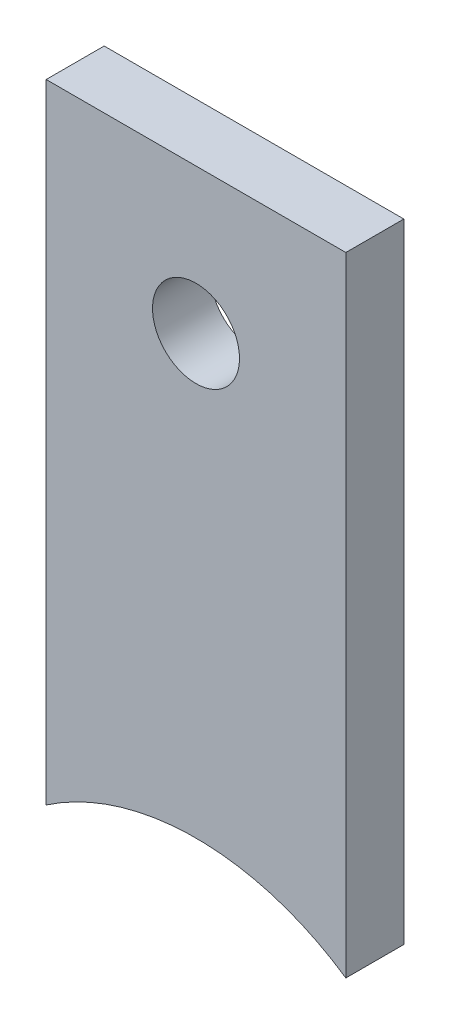
ISO-10303-21;
HEADER;
FILE_DESCRIPTION(('STEP AP214'),'2;1');
FILE_NAME('part.step','',(''),(''),'','','');
FILE_SCHEMA(('AUTOMOTIVE_DESIGN { 1 0 10303 214 1 1 1 1 }'));
ENDSEC;
DATA;
#1=APPLICATION_CONTEXT('core data for automotive mechanical design processes');
#2=APPLICATION_PROTOCOL_DEFINITION('international standard','automotive_design',2000,#1);
#3=PRODUCT_CONTEXT('',#1,'mechanical');
#4=PRODUCT('Part','Part','',(#3));
#5=PRODUCT_RELATED_PRODUCT_CATEGORY('part','',(#4));
#6=PRODUCT_DEFINITION_FORMATION('','',#4);
#7=PRODUCT_DEFINITION_CONTEXT('part definition',#1,'design');
#8=PRODUCT_DEFINITION('design','',#6,#7);
#9=PRODUCT_DEFINITION_SHAPE('','',#8);
#10=(LENGTH_UNIT() NAMED_UNIT(*) SI_UNIT(.MILLI.,.METRE.));
#11=(NAMED_UNIT(*) PLANE_ANGLE_UNIT() SI_UNIT($,.RADIAN.));
#12=(NAMED_UNIT(*) SI_UNIT($,.STERADIAN.) SOLID_ANGLE_UNIT());
#13=UNCERTAINTY_MEASURE_WITH_UNIT(LENGTH_MEASURE(1.E-05),#10,'distance_accuracy_value','');
#14=(GEOMETRIC_REPRESENTATION_CONTEXT(3) GLOBAL_UNCERTAINTY_ASSIGNED_CONTEXT((#13)) GLOBAL_UNIT_ASSIGNED_CONTEXT((#10,
#11,#12)) REPRESENTATION_CONTEXT('',''));
#15=CARTESIAN_POINT('',(0.,0.,0.));
#16=DIRECTION('',(0.,0.,1.));
#17=DIRECTION('',(1.,0.,0.));
#18=AXIS2_PLACEMENT_3D('',#15,#16,#17);
#19=CARTESIAN_POINT('',(0.,146.132978723404,12.));
#20=DIRECTION('',(-1.,0.,0.));
#21=DIRECTION('',(0.,-1.,0.));
#22=AXIS2_PLACEMENT_3D('',#19,#20,#21);
#23=PLANE('',#22);
#24=DIRECTION('',(0.,1.,0.));
#25=VECTOR('',#24,1.);
#26=CARTESIAN_POINT('',(0.,146.132978723404,0.));
#27=LINE('',#26,#25);
#28=CARTESIAN_POINT('',(0.,16.1329787234042,0.));
#29=VERTEX_POINT('',#28);
#30=CARTESIAN_POINT('',(0.,146.132978723404,0.));
#31=VERTEX_POINT('',#30);
#32=EDGE_CURVE('E98',#29,#31,#27,.T.);
#33=ORIENTED_EDGE('',*,*,#32,.T.);
#34=DIRECTION('',(0.,0.,-1.));
#35=VECTOR('',#34,1.);
#36=CARTESIAN_POINT('',(0.,146.132978723404,12.));
#37=LINE('',#36,#35);
#38=CARTESIAN_POINT('',(0.,146.132978723404,12.));
#39=VERTEX_POINT('',#38);
#40=EDGE_CURVE('E11',#39,#31,#37,.T.);
#41=ORIENTED_EDGE('',*,*,#40,.F.);
#42=DIRECTION('',(0.,1.,0.));
#43=VECTOR('',#42,1.);
#44=CARTESIAN_POINT('',(0.,146.132978723404,12.));
#45=LINE('',#44,#43);
#46=CARTESIAN_POINT('',(0.,16.1329787234042,12.));
#47=VERTEX_POINT('',#46);
#48=EDGE_CURVE('E86',#47,#39,#45,.T.);
#49=ORIENTED_EDGE('',*,*,#48,.F.);
#50=DIRECTION('',(0.,0.,-1.));
#51=VECTOR('',#50,1.);
#52=CARTESIAN_POINT('',(0.,16.1329787234042,12.));
#53=LINE('',#52,#51);
#54=EDGE_CURVE('E94',#47,#29,#53,.T.);
#55=ORIENTED_EDGE('',*,*,#54,.T.);
#56=EDGE_LOOP('',(#33,#41,#49,#55));
#57=FACE_BOUND('',#56,.T.);
#58=ADVANCED_FACE('F35',(#57),#23,.F.);
#59=CARTESIAN_POINT('',(0.,146.132978723404,12.));
#60=DIRECTION('',(0.,-1.,0.));
#61=DIRECTION('',(0.,0.,-1.));
#62=AXIS2_PLACEMENT_3D('',#59,#60,#61);
#63=PLANE('',#62);
#64=DIRECTION('',(-1.,0.,0.));
#65=VECTOR('',#64,1.);
#66=CARTESIAN_POINT('',(0.,146.132978723404,0.));
#67=LINE('',#66,#65);
#68=CARTESIAN_POINT('',(-62.,146.132978723404,0.));
#69=VERTEX_POINT('',#68);
#70=EDGE_CURVE('E90',#31,#69,#67,.T.);
#71=ORIENTED_EDGE('',*,*,#70,.T.);
#72=DIRECTION('',(0.,0.,-1.));
#73=VECTOR('',#72,1.);
#74=CARTESIAN_POINT('',(-62.,146.132978723404,12.));
#75=LINE('',#74,#73);
#76=CARTESIAN_POINT('',(-62.,146.132978723404,12.));
#77=VERTEX_POINT('',#76);
#78=EDGE_CURVE('E43',#77,#69,#75,.T.);
#79=ORIENTED_EDGE('',*,*,#78,.F.);
#80=DIRECTION('',(-1.,0.,0.));
#81=VECTOR('',#80,1.);
#82=CARTESIAN_POINT('',(0.,146.132978723404,12.));
#83=LINE('',#82,#81);
#84=EDGE_CURVE('E81',#39,#77,#83,.T.);
#85=ORIENTED_EDGE('',*,*,#84,.F.);
#86=ORIENTED_EDGE('',*,*,#40,.T.);
#87=EDGE_LOOP('',(#71,#79,#85,#86));
#88=FACE_BOUND('',#87,.T.);
#89=ADVANCED_FACE('F89',(#88),#63,.F.);
#90=CARTESIAN_POINT('',(-62.,146.132978723404,12.));
#91=DIRECTION('',(1.,0.,0.));
#92=DIRECTION('',(0.,1.,0.));
#93=AXIS2_PLACEMENT_3D('',#90,#91,#92);
#94=PLANE('',#93);
#95=DIRECTION('',(0.,-1.,0.));
#96=VECTOR('',#95,1.);
#97=CARTESIAN_POINT('',(-62.,146.132978723404,0.));
#98=LINE('',#97,#96);
#99=CARTESIAN_POINT('',(-62.,16.1329787234042,0.));
#100=VERTEX_POINT('',#99);
#101=EDGE_CURVE('E68',#69,#100,#98,.T.);
#102=ORIENTED_EDGE('',*,*,#101,.T.);
#103=DIRECTION('',(0.,0.,-1.));
#104=VECTOR('',#103,1.);
#105=CARTESIAN_POINT('',(-62.,16.1329787234042,12.));
#106=LINE('',#105,#104);
#107=CARTESIAN_POINT('',(-62.,16.1329787234042,12.));
#108=VERTEX_POINT('',#107);
#109=EDGE_CURVE('E91',#108,#100,#106,.T.);
#110=ORIENTED_EDGE('',*,*,#109,.F.);
#111=DIRECTION('',(0.,-1.,0.));
#112=VECTOR('',#111,1.);
#113=CARTESIAN_POINT('',(-62.,146.132978723404,12.));
#114=LINE('',#113,#112);
#115=EDGE_CURVE('E84',#77,#108,#114,.T.);
#116=ORIENTED_EDGE('',*,*,#115,.F.);
#117=ORIENTED_EDGE('',*,*,#78,.T.);
#118=EDGE_LOOP('',(#102,#110,#116,#117));
#119=FACE_BOUND('',#118,.T.);
#120=ADVANCED_FACE('F92',(#119),#94,.F.);
#121=CARTESIAN_POINT('',(-31.,-29.298288042998,12.));
#122=DIRECTION('',(0.,0.,-1.));
#123=DIRECTION('',(-1.,0.,0.));
#124=AXIS2_PLACEMENT_3D('',#121,#122,#123);
#125=CYLINDRICAL_SURFACE('',#124,55.);
#126=CARTESIAN_POINT('',(-31.,-29.298288042998,0.));
#127=DIRECTION('',(0.,0.,-1.));
#128=DIRECTION('',(1.,0.,0.));
#129=AXIS2_PLACEMENT_3D('',#126,#127,#128);
#130=CIRCLE('',#129,55.);
#131=EDGE_CURVE('E74',#100,#29,#130,.T.);
#132=ORIENTED_EDGE('',*,*,#131,.T.);
#133=ORIENTED_EDGE('',*,*,#54,.F.);
#134=CARTESIAN_POINT('',(-31.,-29.298288042998,12.));
#135=DIRECTION('',(0.,0.,-1.));
#136=DIRECTION('',(1.,0.,0.));
#137=AXIS2_PLACEMENT_3D('',#134,#135,#136);
#138=CIRCLE('',#137,55.);
#139=EDGE_CURVE('E51',#108,#47,#138,.T.);
#140=ORIENTED_EDGE('',*,*,#139,.F.);
#141=ORIENTED_EDGE('',*,*,#109,.T.);
#142=EDGE_LOOP('',(#132,#133,#140,#141));
#143=FACE_BOUND('',#142,.T.);
#144=ADVANCED_FACE('F106',(#143),#125,.F.);
#145=CARTESIAN_POINT('',(-31.,-29.298288042998,12.));
#146=DIRECTION('',(0.,0.,1.));
#147=DIRECTION('',(1.,0.,0.));
#148=AXIS2_PLACEMENT_3D('',#145,#146,#147);
#149=PLANE('',#148);
#150=CARTESIAN_POINT('',(-31.,116.132978723404,12.));
#151=DIRECTION('',(0.,0.,1.));
#152=DIRECTION('',(1.,0.,0.));
#153=AXIS2_PLACEMENT_3D('',#150,#151,#152);
#154=CIRCLE('',#153,9.00000000000001);
#155=CARTESIAN_POINT('',(-22.,116.132978723404,12.));
#156=VERTEX_POINT('',#155);
#157=EDGE_CURVE('E112',#156,#156,#154,.T.);
#158=ORIENTED_EDGE('',*,*,#157,.F.);
#159=EDGE_LOOP('',(#158));
#160=FACE_BOUND('',#159,.T.);
#161=ORIENTED_EDGE('',*,*,#48,.T.);
#162=ORIENTED_EDGE('',*,*,#84,.T.);
#163=ORIENTED_EDGE('',*,*,#115,.T.);
#164=ORIENTED_EDGE('',*,*,#139,.T.);
#165=EDGE_LOOP('',(#161,#162,#163,#164));
#166=FACE_BOUND('',#165,.T.);
#167=ADVANCED_FACE('F82',(#160,#166),#149,.T.);
#168=CARTESIAN_POINT('',(-31.,-29.298288042998,0.));
#169=DIRECTION('',(0.,0.,1.));
#170=DIRECTION('',(1.,0.,0.));
#171=AXIS2_PLACEMENT_3D('',#168,#169,#170);
#172=PLANE('',#171);
#173=CARTESIAN_POINT('',(-31.,116.132978723404,0.));
#174=DIRECTION('',(0.,0.,1.));
#175=DIRECTION('',(1.,0.,0.));
#176=AXIS2_PLACEMENT_3D('',#173,#174,#175);
#177=CIRCLE('',#176,9.00000000000001);
#178=CARTESIAN_POINT('',(-22.,116.132978723404,0.));
#179=VERTEX_POINT('',#178);
#180=EDGE_CURVE('E101',#179,#179,#177,.T.);
#181=ORIENTED_EDGE('',*,*,#180,.T.);
#182=EDGE_LOOP('',(#181));
#183=FACE_BOUND('',#182,.T.);
#184=ORIENTED_EDGE('',*,*,#32,.F.);
#185=ORIENTED_EDGE('',*,*,#131,.F.);
#186=ORIENTED_EDGE('',*,*,#101,.F.);
#187=ORIENTED_EDGE('',*,*,#70,.F.);
#188=EDGE_LOOP('',(#184,#185,#186,#187));
#189=FACE_BOUND('',#188,.T.);
#190=ADVANCED_FACE('F109',(#183,#189),#172,.F.);
#191=CARTESIAN_POINT('',(-31.,116.132978723404,0.));
#192=DIRECTION('',(0.,0.,1.));
#193=DIRECTION('',(1.,0.,0.));
#194=AXIS2_PLACEMENT_3D('',#191,#192,#193);
#195=CYLINDRICAL_SURFACE('',#194,9.00000000000001);
#196=ORIENTED_EDGE('',*,*,#180,.F.);
#197=EDGE_LOOP('',(#196));
#198=FACE_BOUND('',#197,.T.);
#199=ORIENTED_EDGE('',*,*,#157,.T.);
#200=EDGE_LOOP('',(#199));
#201=FACE_BOUND('',#200,.T.);
#202=ADVANCED_FACE('F119',(#198,#201),#195,.F.);
#203=CLOSED_SHELL('',(#58,#89,#120,#144,#167,#190,#202));
#204=MANIFOLD_SOLID_BREP('B2',#203);
#205=ADVANCED_BREP_SHAPE_REPRESENTATION('',(#18,#204),#14);
#206=SHAPE_DEFINITION_REPRESENTATION(#9,#205);
ENDSEC;
END-ISO-10303-21;
